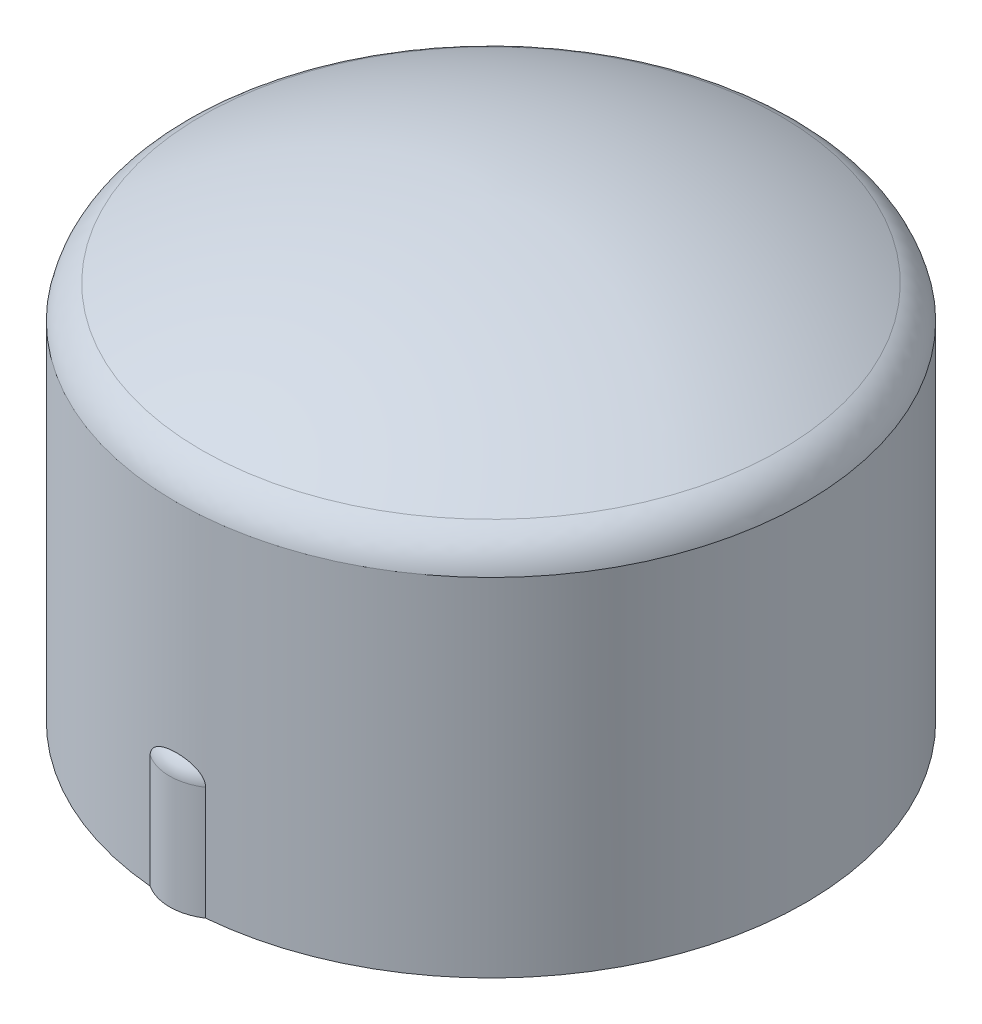
ISO-10303-21;
HEADER;
FILE_DESCRIPTION(('STEP AP214'),'2;1');
FILE_NAME('part.step','',(''),(''),'','','');
FILE_SCHEMA(('AUTOMOTIVE_DESIGN { 1 0 10303 214 1 1 1 1 }'));
ENDSEC;
DATA;
#1=APPLICATION_CONTEXT('core data for automotive mechanical design processes');
#2=APPLICATION_PROTOCOL_DEFINITION('international standard','automotive_design',2000,#1);
#3=PRODUCT_CONTEXT('',#1,'mechanical');
#4=PRODUCT('Part','Part','',(#3));
#5=PRODUCT_RELATED_PRODUCT_CATEGORY('part','',(#4));
#6=PRODUCT_DEFINITION_FORMATION('','',#4);
#7=PRODUCT_DEFINITION_CONTEXT('part definition',#1,'design');
#8=PRODUCT_DEFINITION('design','',#6,#7);
#9=PRODUCT_DEFINITION_SHAPE('','',#8);
#10=(LENGTH_UNIT() NAMED_UNIT(*) SI_UNIT(.MILLI.,.METRE.));
#11=(NAMED_UNIT(*) PLANE_ANGLE_UNIT() SI_UNIT($,.RADIAN.));
#12=(NAMED_UNIT(*) SI_UNIT($,.STERADIAN.) SOLID_ANGLE_UNIT());
#13=UNCERTAINTY_MEASURE_WITH_UNIT(LENGTH_MEASURE(1.E-05),#10,'distance_accuracy_value','');
#14=(GEOMETRIC_REPRESENTATION_CONTEXT(3) GLOBAL_UNCERTAINTY_ASSIGNED_CONTEXT((#13)) GLOBAL_UNIT_ASSIGNED_CONTEXT((#10,
#11,#12)) REPRESENTATION_CONTEXT('',''));
#15=CARTESIAN_POINT('',(0.,0.,0.));
#16=DIRECTION('',(0.,0.,1.));
#17=DIRECTION('',(1.,0.,0.));
#18=AXIS2_PLACEMENT_3D('',#15,#16,#17);
#19=CARTESIAN_POINT('',(0.,0.,0.));
#20=DIRECTION('',(0.,-1.,0.));
#21=DIRECTION('',(0.,0.,-1.));
#22=AXIS2_PLACEMENT_3D('',#19,#20,#21);
#23=CYLINDRICAL_SURFACE('',#22,30.226);
#24=CARTESIAN_POINT('',(0.,0.507999999999999,0.));
#25=DIRECTION('',(0.,1.,0.));
#26=DIRECTION('',(0.,0.,1.));
#27=AXIS2_PLACEMENT_3D('',#24,#25,#26);
#28=CIRCLE('',#27,30.226);
#29=CARTESIAN_POINT('',(0.,0.507999999999999,30.226));
#30=VERTEX_POINT('',#29);
#31=EDGE_CURVE('E47',#30,#30,#28,.F.);
#32=ORIENTED_EDGE('',*,*,#31,.T.);
#33=EDGE_LOOP('',(#32));
#34=FACE_BOUND('',#33,.T.);
#35=CARTESIAN_POINT('',(0.,38.1,0.));
#36=DIRECTION('',(0.,-1.,0.));
#37=DIRECTION('',(0.,0.,-1.));
#38=AXIS2_PLACEMENT_3D('',#35,#36,#37);
#39=CIRCLE('',#38,30.226);
#40=CARTESIAN_POINT('',(0.,38.1,-30.226));
#41=VERTEX_POINT('',#40);
#42=EDGE_CURVE('E106',#41,#41,#39,.T.);
#43=ORIENTED_EDGE('',*,*,#42,.F.);
#44=EDGE_LOOP('',(#43));
#45=FACE_BOUND('',#44,.T.);
#46=ADVANCED_FACE('F39',(#34,#45),#23,.F.);
#47=CARTESIAN_POINT('',(0.,38.1,30.226));
#48=CARTESIAN_POINT('',(0.,41.8981415100118,23.6802943761118));
#49=CARTESIAN_POINT('',(0.,44.2809246035686,16.7376277100559));
#50=CARTESIAN_POINT('',(0.,45.2483492809118,9.398));
#51=B_SPLINE_CURVE_WITH_KNOTS('',3,(#47,#48,#49,#50),.UNSPECIFIED.,.F.,.F.,(4,4),(0.,
0.705520621299184),.UNSPECIFIED.);
#52=CARTESIAN_POINT('',(0.,0.,0.));
#53=DIRECTION('',(0.,-1.,0.));
#54=AXIS1_PLACEMENT('',#52,#53);
#55=SURFACE_OF_REVOLUTION('',#51,#54);
#56=CARTESIAN_POINT('',(0.,45.2483492809118,0.));
#57=DIRECTION('',(0.,-1.,0.));
#58=DIRECTION('',(0.,0.,-1.));
#59=AXIS2_PLACEMENT_3D('',#56,#57,#58);
#60=CIRCLE('',#59,9.398);
#61=CARTESIAN_POINT('',(0.,45.2483492809118,-9.398));
#62=VERTEX_POINT('',#61);
#63=EDGE_CURVE('E103',#62,#62,#60,.T.);
#64=ORIENTED_EDGE('',*,*,#63,.F.);
#65=EDGE_LOOP('',(#64));
#66=FACE_BOUND('',#65,.T.);
#67=ORIENTED_EDGE('',*,*,#42,.T.);
#68=EDGE_LOOP('',(#67));
#69=FACE_BOUND('',#68,.T.);
#70=ADVANCED_FACE('F124',(#66,#69),#55,.T.);
#71=CARTESIAN_POINT('',(0.,0.,0.));
#72=DIRECTION('',(0.,-1.,0.));
#73=DIRECTION('',(0.,0.,-1.));
#74=AXIS2_PLACEMENT_3D('',#71,#72,#73);
#75=CYLINDRICAL_SURFACE('',#74,9.398);
#76=CARTESIAN_POINT('',(0.,42.8999078795357,0.));
#77=DIRECTION('',(0.,-1.,0.));
#78=DIRECTION('',(0.,0.,-1.));
#79=AXIS2_PLACEMENT_3D('',#76,#77,#78);
#80=CIRCLE('',#79,9.398);
#81=CARTESIAN_POINT('',(0.,42.8999078795357,-9.398));
#82=VERTEX_POINT('',#81);
#83=EDGE_CURVE('E100',#82,#82,#80,.T.);
#84=ORIENTED_EDGE('',*,*,#83,.F.);
#85=EDGE_LOOP('',(#84));
#86=FACE_BOUND('',#85,.T.);
#87=ORIENTED_EDGE('',*,*,#63,.T.);
#88=EDGE_LOOP('',(#87));
#89=FACE_BOUND('',#88,.T.);
#90=ADVANCED_FACE('F129',(#86,#89),#75,.T.);
#91=CARTESIAN_POINT('',(0.,42.8999078795357,9.398));
#92=CARTESIAN_POINT('',(0.,44.0350548501314,4.75700160121964));
#93=CARTESIAN_POINT('',(0.,44.5081005748986,0.));
#94=B_SPLINE_CURVE_WITH_KNOTS('',2,(#91,#92,#93),.UNSPECIFIED.,.F.,.F.,(3,3),(0.,1.),.UNSPECIFIED.);
#95=CARTESIAN_POINT('',(0.,0.,0.));
#96=DIRECTION('',(0.,-1.,0.));
#97=AXIS1_PLACEMENT('',#95,#96);
#98=SURFACE_OF_REVOLUTION('',#94,#97);
#99=CARTESIAN_POINT('',(0.,44.5081005748986,0.));
#100=VERTEX_POINT('',#99);
#101=VERTEX_LOOP('',#100);
#102=FACE_BOUND('',#101,.T.);
#103=ORIENTED_EDGE('',*,*,#83,.T.);
#104=EDGE_LOOP('',(#103));
#105=FACE_BOUND('',#104,.T.);
#106=ADVANCED_FACE('F148',(#102,#105),#98,.T.);
#107=CARTESIAN_POINT('',(0.,50.038,0.));
#108=CARTESIAN_POINT('',(0.,49.7601700984439,17.0298925381683));
#109=CARTESIAN_POINT('',(0.,41.6889766496682,31.7933190738633));
#110=B_SPLINE_CURVE_WITH_KNOTS('',2,(#107,#108,#109),.UNSPECIFIED.,.F.,.F.,(3,3),(0.,1.),.UNSPECIFIED.);
#111=CARTESIAN_POINT('',(0.,0.,0.));
#112=DIRECTION('',(0.,-1.,0.));
#113=AXIS1_PLACEMENT('',#111,#112);
#114=SURFACE_OF_REVOLUTION('',#110,#113);
#115=CARTESIAN_POINT('',(0.,41.6889766496682,0.));
#116=DIRECTION('',(0.,-1.,0.));
#117=DIRECTION('',(0.,0.,-1.));
#118=AXIS2_PLACEMENT_3D('',#115,#116,#117);
#119=CIRCLE('',#118,31.7933190738633);
#120=CARTESIAN_POINT('',(0.,41.6889766496682,-31.7933190738633));
#121=VERTEX_POINT('',#120);
#122=EDGE_CURVE('E89',#121,#121,#119,.T.);
#123=ORIENTED_EDGE('',*,*,#122,.F.);
#124=EDGE_LOOP('',(#123));
#125=FACE_BOUND('',#124,.T.);
#126=CARTESIAN_POINT('',(0.,50.038,0.));
#127=VERTEX_POINT('',#126);
#128=VERTEX_LOOP('',#127);
#129=FACE_BOUND('',#128,.T.);
#130=ADVANCED_FACE('F151',(#125,#129),#114,.T.);
#131=CARTESIAN_POINT('',(0.,41.6889766496682,31.7933190738633));
#132=CARTESIAN_POINT('',(0.,40.5292062065001,34.0210803381325));
#133=CARTESIAN_POINT('',(0.,38.1,34.544));
#134=B_SPLINE_CURVE_WITH_KNOTS('',2,(#131,#132,#133),.UNSPECIFIED.,.F.,.F.,(3,3),(0.,1.),.UNSPECIFIED.);
#135=CARTESIAN_POINT('',(0.,0.,0.));
#136=DIRECTION('',(0.,-1.,0.));
#137=AXIS1_PLACEMENT('',#135,#136);
#138=SURFACE_OF_REVOLUTION('',#134,#137);
#139=CARTESIAN_POINT('',(0.,38.1,0.));
#140=DIRECTION('',(0.,-1.,0.));
#141=DIRECTION('',(0.,0.,-1.));
#142=AXIS2_PLACEMENT_3D('',#139,#140,#141);
#143=CIRCLE('',#142,34.544);
#144=CARTESIAN_POINT('',(0.,38.1,-34.544));
#145=VERTEX_POINT('',#144);
#146=EDGE_CURVE('E86',#145,#145,#143,.T.);
#147=ORIENTED_EDGE('',*,*,#146,.F.);
#148=EDGE_LOOP('',(#147));
#149=FACE_BOUND('',#148,.T.);
#150=ORIENTED_EDGE('',*,*,#122,.T.);
#151=EDGE_LOOP('',(#150));
#152=FACE_BOUND('',#151,.T.);
#153=ADVANCED_FACE('F154',(#149,#152),#138,.T.);
#154=CARTESIAN_POINT('',(0.,0.,0.));
#155=DIRECTION('',(0.,-1.,0.));
#156=DIRECTION('',(0.,0.,-1.));
#157=AXIS2_PLACEMENT_3D('',#154,#155,#156);
#158=CYLINDRICAL_SURFACE('',#157,34.544);
#159=CARTESIAN_POINT('',(0.,0.,0.));
#160=DIRECTION('',(0.,-1.,0.));
#161=DIRECTION('',(0.,0.,-1.));
#162=AXIS2_PLACEMENT_3D('',#159,#160,#161);
#163=CIRCLE('',#162,34.544);
#164=CARTESIAN_POINT('',(-3.03123756678664,0.,34.4107473736579));
#165=VERTEX_POINT('',#164);
#166=CARTESIAN_POINT('',(3.06476243321335,0.,34.4077777141733));
#167=VERTEX_POINT('',#166);
#168=EDGE_CURVE('E76',#165,#167,#163,.T.);
#169=ORIENTED_EDGE('',*,*,#168,.F.);
#170=DIRECTION('',(0.,-1.,0.));
#171=VECTOR('',#170,1.);
#172=CARTESIAN_POINT('',(-3.03123756678666,14.986,34.4107473736579));
#173=LINE('',#172,#171);
#174=CARTESIAN_POINT('',(-3.03123756678666,12.446,34.4107473736579));
#175=VERTEX_POINT('',#174);
#176=EDGE_CURVE('E78',#175,#165,#173,.T.);
#177=ORIENTED_EDGE('',*,*,#176,.F.);
#178=CARTESIAN_POINT('',(-3.03123756678666,12.446,34.4107473736579));
#179=CARTESIAN_POINT('',(-3.03124265458582,12.4813203191701,34.4107465750031));
#180=CARTESIAN_POINT('',(-3.02968263184366,12.5166219616923,34.4108843795726));
#181=CARTESIAN_POINT('',(-3.02349329131249,12.5869328470516,34.4114289007313));
#182=CARTESIAN_POINT('',(-3.0188657662599,12.6219422485888,34.411835460252));
#183=CARTESIAN_POINT('',(-3.00056488928335,12.7256766011273,34.4134378225876));
#184=CARTESIAN_POINT('',(-2.98247111072703,12.7936585939074,34.4150165804838));
#185=CARTESIAN_POINT('',(-2.93570995517836,12.9256094010482,34.4190365975997));
#186=CARTESIAN_POINT('',(-2.9070639633315,12.9895860280063,34.4214761119894));
#187=CARTESIAN_POINT('',(-2.84075425145328,13.112734535189,34.4270121051227));
#188=CARTESIAN_POINT('',(-2.8030740609034,13.1718973722844,34.4301097825954));
#189=CARTESIAN_POINT('',(-2.70035636379285,13.3120583003851,34.4383472550711));
#190=CARTESIAN_POINT('',(-2.6308956530918,13.3898007583666,34.4437507381813));
#191=CARTESIAN_POINT('',(-2.4804879717951,13.5331510447034,34.4549103635572));
#192=CARTESIAN_POINT('',(-2.39951792318607,13.5987338669994,34.4606672008452));
#193=CARTESIAN_POINT('',(-2.18627421227936,13.7491954927748,34.4749843494915));
#194=CARTESIAN_POINT('',(-2.04891522066509,13.8268279590773,34.4834751965463));
#195=CARTESIAN_POINT('',(-1.76396424372568,13.9603780457658,34.4992305710486));
#196=CARTESIAN_POINT('',(-1.61634587700679,14.0162370443411,34.5064917585356));
#197=CARTESIAN_POINT('',(-1.3407803794257,14.1019587187551,34.5181978070844));
#198=CARTESIAN_POINT('',(-1.21368555287464,14.1346099554841,34.5229107532192));
#199=CARTESIAN_POINT('',(-0.957079653641533,14.1890084781166,34.5309777863253));
#200=CARTESIAN_POINT('',(-0.827566861614029,14.2107476726921,34.5343308645958));
#201=CARTESIAN_POINT('',(-0.567293871064644,14.2444508973579,34.5395868434282));
#202=CARTESIAN_POINT('',(-0.436533884554245,14.2564165599197,34.5414899861689));
#203=CARTESIAN_POINT('',(-0.174555776716379,14.2712269194306,34.5438073890377));
#204=CARTESIAN_POINT('',(-0.0433378581620062,14.2740752401316,34.5442222407055));
#205=CARTESIAN_POINT('',(0.269660940758386,14.2702206568907,34.5434254799487));
#206=CARTESIAN_POINT('',(0.451405147035204,14.2594058896877,34.5415241248138));
#207=CARTESIAN_POINT('',(0.813253864525192,14.2194728415567,34.5349000846687));
#208=CARTESIAN_POINT('',(0.993354774784649,14.1903211674536,34.5301722531684));
#209=CARTESIAN_POINT('',(1.27686580564047,14.1267277456873,34.5205555954254));
#210=CARTESIAN_POINT('',(1.38183858610071,14.0991917068119,34.5165049180101));
#211=CARTESIAN_POINT('',(1.58910568169224,14.0355689696131,34.5075867766555));
#212=CARTESIAN_POINT('',(1.69139848092529,13.999477543253,34.5027188615147));
#213=CARTESIAN_POINT('',(1.99144737740956,13.8769682659013,34.4871172806823));
#214=CARTESIAN_POINT('',(2.1840329780777,13.7759868427034,34.4753272372027));
#215=CARTESIAN_POINT('',(2.43414176886859,13.5972791567541,34.4582178648676));
#216=CARTESIAN_POINT('',(2.50590398456142,13.5392966664028,34.4530552737561));
#217=CARTESIAN_POINT('',(2.64070675104401,13.4137090679934,34.4429833779523));
#218=CARTESIAN_POINT('',(2.70374485921038,13.3461012756964,34.4380741444369));
#219=CARTESIAN_POINT('',(2.81857053910703,13.2003392801914,34.428868417239));
#220=CARTESIAN_POINT('',(2.87020575859828,13.1220625211872,34.4245804571731));
#221=CARTESIAN_POINT('',(2.95710874008404,12.956936821852,34.4172247892896));
#222=CARTESIAN_POINT('',(2.99243334166846,12.8701189490536,34.414152849284));
#223=CARTESIAN_POINT('',(3.03321063555388,12.7262937670847,34.4105770814334));
#224=CARTESIAN_POINT('',(3.04495035963299,12.6710403914649,34.4095382100238));
#225=CARTESIAN_POINT('',(3.06076540812611,12.5592190237281,34.4081337835335));
#226=CARTESIAN_POINT('',(3.06480975320274,12.5026466421556,34.4077709501043));
#227=CARTESIAN_POINT('',(3.06476243321334,12.446,34.4077777141734));
#228=B_SPLINE_CURVE_WITH_KNOTS('',3,(#178,#179,#180,#181,#182,#183,#184,#185,#186,#187,#188,
#189,#190,#191,#192,#193,#194,#195,#196,#197,#198,#199,#200,#201,#202,#203,#204,#205,#206,#207,
#208,#209,#210,#211,#212,#213,#214,#215,#216,#217,#218,#219,#220,#221,#222,#223,#224,#225,#226,
#227),.UNSPECIFIED.,.F.,.F.,(4,2,2,2,2,2,2,2,2,2,2,2,2,2,2,2,2,2,2,2,2,2,2,2,4),(0.,
0.105890633136441,0.211719435243513,0.421746895624058,0.631351034678505,0.84134025462867,
1.15275439600517,1.46480201852474,1.93618516776689,2.40882882151925,2.80221557678567,
3.19589360076338,3.58950585531202,3.98296164646256,4.52831488457895,5.07466414727515,
5.40008951009659,5.72569513651927,6.37188351778553,6.64840859947657,6.9250109482136,
7.20511114173238,7.48422772915803,7.65321324850191,7.8228776264186),.UNSPECIFIED.);
#229=CARTESIAN_POINT('',(3.06476243321335,12.446,34.4077777141733));
#230=VERTEX_POINT('',#229);
#231=EDGE_CURVE('E53',#175,#230,#228,.T.);
#232=ORIENTED_EDGE('',*,*,#231,.T.);
#233=DIRECTION('',(0.,-1.,0.));
#234=VECTOR('',#233,1.);
#235=CARTESIAN_POINT('',(3.06476243321335,14.986,34.4077777141733));
#236=LINE('',#235,#234);
#237=EDGE_CURVE('E71',#230,#167,#236,.T.);
#238=ORIENTED_EDGE('',*,*,#237,.T.);
#239=EDGE_LOOP('',(#169,#177,#232,#238));
#240=FACE_BOUND('',#239,.T.);
#241=ORIENTED_EDGE('',*,*,#146,.T.);
#242=EDGE_LOOP('',(#241));
#243=FACE_BOUND('',#242,.T.);
#244=ADVANCED_FACE('F73',(#240,#243),#158,.T.);
#245=CARTESIAN_POINT('',(0.,0.,30.226));
#246=DIRECTION('',(0.,1.,0.));
#247=DIRECTION('',(0.,0.,1.));
#248=AXIS2_PLACEMENT_3D('',#245,#246,#247);
#249=PLANE('',#248);
#250=CARTESIAN_POINT('',(0.,0.,0.));
#251=DIRECTION('',(0.,1.,0.));
#252=DIRECTION('',(0.,0.,1.));
#253=AXIS2_PLACEMENT_3D('',#250,#251,#252);
#254=CIRCLE('',#253,30.734);
#255=CARTESIAN_POINT('',(0.,0.,30.734));
#256=VERTEX_POINT('',#255);
#257=EDGE_CURVE('E11',#256,#256,#254,.T.);
#258=ORIENTED_EDGE('',*,*,#257,.T.);
#259=EDGE_LOOP('',(#258));
#260=FACE_BOUND('',#259,.T.);
#261=ORIENTED_EDGE('',*,*,#168,.T.);
#262=CARTESIAN_POINT('',(0.0144976076855098,0.,29.7601179232271));
#263=DIRECTION('',(0.,-1.,0.));
#264=DIRECTION('',(0.,0.,1.));
#265=AXIS2_PLACEMENT_3D('',#262,#263,#264);
#266=CIRCLE('',#265,5.55921370683221);
#267=EDGE_CURVE('E79',#167,#165,#266,.T.);
#268=ORIENTED_EDGE('',*,*,#267,.T.);
#269=EDGE_LOOP('',(#261,#268));
#270=FACE_BOUND('',#269,.T.);
#271=ADVANCED_FACE('F85',(#260,#270),#249,.F.);
#272=CARTESIAN_POINT('',(0.0144976076855098,14.986,29.7601179232271));
#273=DIRECTION('',(0.,-1.,0.));
#274=DIRECTION('',(0.,0.,-1.));
#275=AXIS2_PLACEMENT_3D('',#272,#273,#274);
#276=CYLINDRICAL_SURFACE('',#275,5.55921370683221);
#277=ORIENTED_EDGE('',*,*,#237,.F.);
#278=CARTESIAN_POINT('',(0.0144976076855098,12.446,29.7601179232271));
#279=DIRECTION('',(0.,1.,0.));
#280=DIRECTION('',(0.,0.,1.));
#281=AXIS2_PLACEMENT_3D('',#278,#279,#280);
#282=CIRCLE('',#281,5.55921370683221);
#283=EDGE_CURVE('E109',#230,#175,#282,.F.);
#284=ORIENTED_EDGE('',*,*,#283,.T.);
#285=ORIENTED_EDGE('',*,*,#176,.T.);
#286=ORIENTED_EDGE('',*,*,#267,.F.);
#287=EDGE_LOOP('',(#277,#284,#285,#286));
#288=FACE_BOUND('',#287,.T.);
#289=ADVANCED_FACE('F82',(#288),#276,.T.);
#290=CARTESIAN_POINT('',(0.0144976076855098,12.446,29.7601179232271));
#291=DIRECTION('',(0.,1.,0.));
#292=DIRECTION('',(0.,0.,1.));
#293=AXIS2_PLACEMENT_3D('',#290,#291,#292);
#294=TOROIDAL_SURFACE('',#293,3.01921370683221,2.54);
#295=ORIENTED_EDGE('',*,*,#283,.F.);
#296=ORIENTED_EDGE('',*,*,#231,.F.);
#297=EDGE_LOOP('',(#295,#296));
#298=FACE_BOUND('',#297,.T.);
#299=ADVANCED_FACE('F118',(#298),#294,.T.);
#300=CARTESIAN_POINT('',(0.,0.507999999999999,0.));
#301=DIRECTION('',(0.,1.,0.));
#302=DIRECTION('',(0.,0.,1.));
#303=AXIS2_PLACEMENT_3D('',#300,#301,#302);
#304=TOROIDAL_SURFACE('',#303,30.734,0.508);
#305=ORIENTED_EDGE('',*,*,#257,.F.);
#306=EDGE_LOOP('',(#305));
#307=FACE_BOUND('',#306,.T.);
#308=ORIENTED_EDGE('',*,*,#31,.F.);
#309=EDGE_LOOP('',(#308));
#310=FACE_BOUND('',#309,.T.);
#311=ADVANCED_FACE('F41',(#307,#310),#304,.T.);
#312=CLOSED_SHELL('',(#46,#70,#90,#106,#130,#153,#244,#271,#289,#299,#311));
#313=MANIFOLD_SOLID_BREP('B2',#312);
#314=ADVANCED_BREP_SHAPE_REPRESENTATION('',(#18,#313),#14);
#315=SHAPE_DEFINITION_REPRESENTATION(#9,#314);
ENDSEC;
END-ISO-10303-21;
